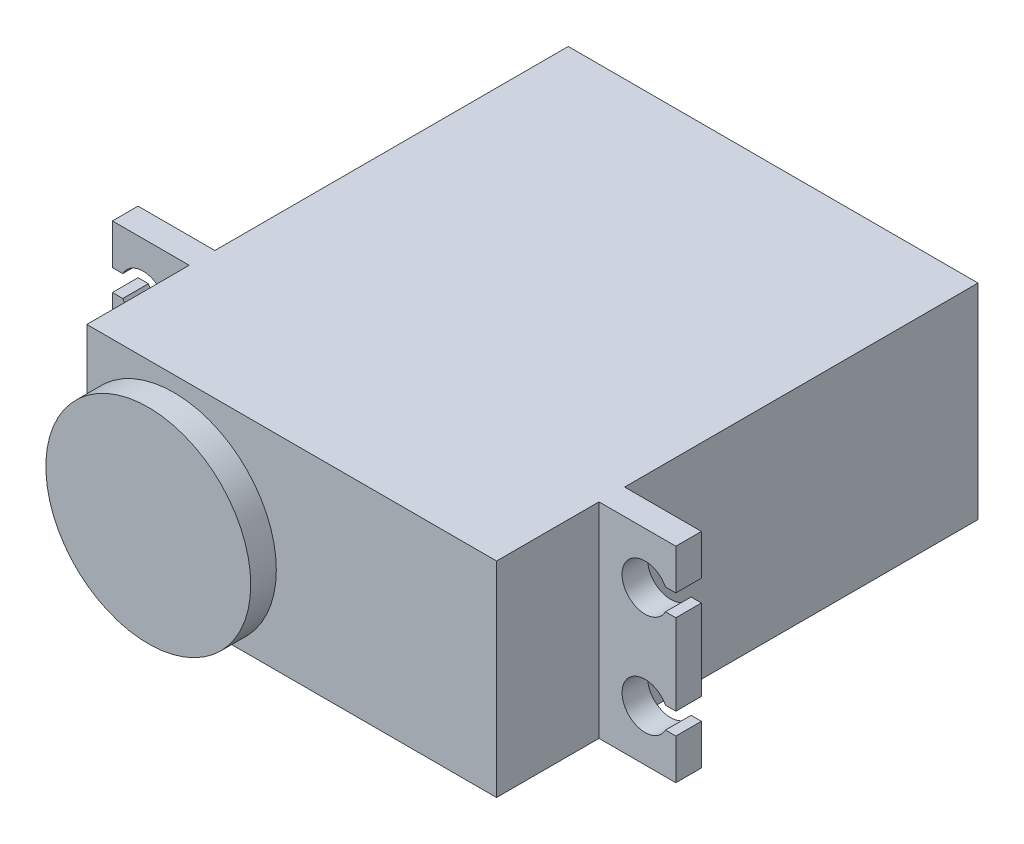
ISO-10303-21;
HEADER;
FILE_DESCRIPTION(('STEP AP214'),'2;1');
FILE_NAME('part.step','',(''),(''),'','','');
FILE_SCHEMA(('AUTOMOTIVE_DESIGN { 1 0 10303 214 1 1 1 1 }'));
ENDSEC;
DATA;
#1=APPLICATION_CONTEXT('core data for automotive mechanical design processes');
#2=APPLICATION_PROTOCOL_DEFINITION('international standard','automotive_design',2000,#1);
#3=PRODUCT_CONTEXT('',#1,'mechanical');
#4=PRODUCT('Part','Part','',(#3));
#5=PRODUCT_RELATED_PRODUCT_CATEGORY('part','',(#4));
#6=PRODUCT_DEFINITION_FORMATION('','',#4);
#7=PRODUCT_DEFINITION_CONTEXT('part definition',#1,'design');
#8=PRODUCT_DEFINITION('design','',#6,#7);
#9=PRODUCT_DEFINITION_SHAPE('','',#8);
#10=(LENGTH_UNIT() NAMED_UNIT(*) SI_UNIT(.MILLI.,.METRE.));
#11=(NAMED_UNIT(*) PLANE_ANGLE_UNIT() SI_UNIT($,.RADIAN.));
#12=(NAMED_UNIT(*) SI_UNIT($,.STERADIAN.) SOLID_ANGLE_UNIT());
#13=UNCERTAINTY_MEASURE_WITH_UNIT(LENGTH_MEASURE(1.E-05),#10,'distance_accuracy_value','');
#14=(GEOMETRIC_REPRESENTATION_CONTEXT(3) GLOBAL_UNCERTAINTY_ASSIGNED_CONTEXT((#13)) GLOBAL_UNIT_ASSIGNED_CONTEXT((#10,
#11,#12)) REPRESENTATION_CONTEXT('',''));
#15=CARTESIAN_POINT('',(0.,0.,0.));
#16=DIRECTION('',(0.,0.,1.));
#17=DIRECTION('',(1.,0.,0.));
#18=AXIS2_PLACEMENT_3D('',#15,#16,#17);
#19=CARTESIAN_POINT('',(47.5,0.,-12.5));
#20=DIRECTION('',(0.,0.,1.));
#21=DIRECTION('',(1.,0.,0.));
#22=AXIS2_PLACEMENT_3D('',#19,#20,#21);
#23=PLANE('',#22);
#24=DIRECTION('',(-1.,0.,0.));
#25=VECTOR('',#24,1.);
#26=CARTESIAN_POINT('',(40.,16.05,-12.5));
#27=LINE('',#26,#25);
#28=CARTESIAN_POINT('',(47.5,16.05,-12.5));
#29=VERTEX_POINT('',#28);
#30=CARTESIAN_POINT('',(46.4899748742132,16.05,-12.5));
#31=VERTEX_POINT('',#30);
#32=EDGE_CURVE('E221',#29,#31,#27,.T.);
#33=ORIENTED_EDGE('',*,*,#32,.T.);
#34=CARTESIAN_POINT('',(44.5,15.,-12.5));
#35=DIRECTION('',(0.,0.,1.));
#36=DIRECTION('',(1.,0.,0.));
#37=AXIS2_PLACEMENT_3D('',#34,#35,#36);
#38=CIRCLE('',#37,2.25);
#39=CARTESIAN_POINT('',(46.4899748742132,13.95,-12.5));
#40=VERTEX_POINT('',#39);
#41=EDGE_CURVE('E232',#31,#40,#38,.T.);
#42=ORIENTED_EDGE('',*,*,#41,.T.);
#43=DIRECTION('',(1.,0.,0.));
#44=VECTOR('',#43,1.);
#45=CARTESIAN_POINT('',(40.,13.95,-12.5));
#46=LINE('',#45,#44);
#47=CARTESIAN_POINT('',(47.5,13.95,-12.5));
#48=VERTEX_POINT('',#47);
#49=EDGE_CURVE('E271',#40,#48,#46,.T.);
#50=ORIENTED_EDGE('',*,*,#49,.T.);
#51=DIRECTION('',(0.,1.,0.));
#52=VECTOR('',#51,1.);
#53=CARTESIAN_POINT('',(47.5,0.,-12.5));
#54=LINE('',#53,#52);
#55=CARTESIAN_POINT('',(47.5,6.05,-12.5));
#56=VERTEX_POINT('',#55);
#57=EDGE_CURVE('E247',#56,#48,#54,.T.);
#58=ORIENTED_EDGE('',*,*,#57,.F.);
#59=DIRECTION('',(1.,0.,0.));
#60=VECTOR('',#59,1.);
#61=CARTESIAN_POINT('',(40.,6.05,-12.5));
#62=LINE('',#61,#60);
#63=CARTESIAN_POINT('',(46.4899748742132,6.05,-12.5));
#64=VERTEX_POINT('',#63);
#65=EDGE_CURVE('E484',#64,#56,#62,.T.);
#66=ORIENTED_EDGE('',*,*,#65,.F.);
#67=CARTESIAN_POINT('',(44.5,5.,-12.5));
#68=DIRECTION('',(0.,0.,1.));
#69=DIRECTION('',(1.,0.,0.));
#70=AXIS2_PLACEMENT_3D('',#67,#68,#69);
#71=CIRCLE('',#70,2.25);
#72=CARTESIAN_POINT('',(46.4899748742132,3.95,-12.5));
#73=VERTEX_POINT('',#72);
#74=EDGE_CURVE('E482',#64,#73,#71,.T.);
#75=ORIENTED_EDGE('',*,*,#74,.T.);
#76=DIRECTION('',(1.,0.,0.));
#77=VECTOR('',#76,1.);
#78=CARTESIAN_POINT('',(40.,3.95,-12.5));
#79=LINE('',#78,#77);
#80=CARTESIAN_POINT('',(47.5,3.95,-12.5));
#81=VERTEX_POINT('',#80);
#82=EDGE_CURVE('E462',#73,#81,#79,.T.);
#83=ORIENTED_EDGE('',*,*,#82,.T.);
#84=CARTESIAN_POINT('',(47.5,0.,-12.5));
#85=VERTEX_POINT('',#84);
#86=EDGE_CURVE('E250',#85,#81,#54,.T.);
#87=ORIENTED_EDGE('',*,*,#86,.F.);
#88=DIRECTION('',(-1.,0.,0.));
#89=VECTOR('',#88,1.);
#90=CARTESIAN_POINT('',(47.5,0.,-12.5));
#91=LINE('',#90,#89);
#92=CARTESIAN_POINT('',(40.,0.,-12.5));
#93=VERTEX_POINT('',#92);
#94=EDGE_CURVE('E279',#85,#93,#91,.T.);
#95=ORIENTED_EDGE('',*,*,#94,.T.);
#96=DIRECTION('',(0.,1.,0.));
#97=VECTOR('',#96,1.);
#98=CARTESIAN_POINT('',(40.,0.,-12.5));
#99=LINE('',#98,#97);
#100=CARTESIAN_POINT('',(40.,20.,-12.5));
#101=VERTEX_POINT('',#100);
#102=EDGE_CURVE('E269',#93,#101,#99,.T.);
#103=ORIENTED_EDGE('',*,*,#102,.T.);
#104=DIRECTION('',(-1.,0.,0.));
#105=VECTOR('',#104,1.);
#106=CARTESIAN_POINT('',(47.5,20.,-12.5));
#107=LINE('',#106,#105);
#108=CARTESIAN_POINT('',(47.5,20.,-12.5));
#109=VERTEX_POINT('',#108);
#110=EDGE_CURVE('E245',#109,#101,#107,.T.);
#111=ORIENTED_EDGE('',*,*,#110,.F.);
#112=EDGE_CURVE('E238',#29,#109,#54,.T.);
#113=ORIENTED_EDGE('',*,*,#112,.F.);
#114=EDGE_LOOP('',(#33,#42,#50,#58,#66,#75,#83,#87,#95,#103,#111,#113));
#115=FACE_BOUND('',#114,.T.);
#116=ADVANCED_FACE('F36',(#115),#23,.F.);
#117=CARTESIAN_POINT('',(47.5,0.,-10.));
#118=DIRECTION('',(0.,0.,1.));
#119=DIRECTION('',(1.,0.,0.));
#120=AXIS2_PLACEMENT_3D('',#117,#118,#119);
#121=PLANE('',#120);
#122=CARTESIAN_POINT('',(44.5,15.,-10.));
#123=DIRECTION('',(0.,0.,-1.));
#124=DIRECTION('',(-1.,0.,0.));
#125=AXIS2_PLACEMENT_3D('',#122,#123,#124);
#126=CIRCLE('',#125,2.25);
#127=CARTESIAN_POINT('',(46.4899748742132,13.95,-10.));
#128=VERTEX_POINT('',#127);
#129=CARTESIAN_POINT('',(46.4899748742132,16.05,-10.));
#130=VERTEX_POINT('',#129);
#131=EDGE_CURVE('E231',#128,#130,#126,.T.);
#132=ORIENTED_EDGE('',*,*,#131,.T.);
#133=DIRECTION('',(1.,0.,0.));
#134=VECTOR('',#133,1.);
#135=CARTESIAN_POINT('',(40.,16.05,-10.));
#136=LINE('',#135,#134);
#137=CARTESIAN_POINT('',(47.5,16.05,-10.));
#138=VERTEX_POINT('',#137);
#139=EDGE_CURVE('E470',#130,#138,#136,.T.);
#140=ORIENTED_EDGE('',*,*,#139,.T.);
#141=DIRECTION('',(0.,1.,0.));
#142=VECTOR('',#141,1.);
#143=CARTESIAN_POINT('',(47.5,0.,-10.));
#144=LINE('',#143,#142);
#145=CARTESIAN_POINT('',(47.5,20.,-10.));
#146=VERTEX_POINT('',#145);
#147=EDGE_CURVE('E240',#138,#146,#144,.T.);
#148=ORIENTED_EDGE('',*,*,#147,.T.);
#149=DIRECTION('',(-1.,0.,0.));
#150=VECTOR('',#149,1.);
#151=CARTESIAN_POINT('',(47.5,20.,-10.));
#152=LINE('',#151,#150);
#153=CARTESIAN_POINT('',(40.,20.,-10.));
#154=VERTEX_POINT('',#153);
#155=EDGE_CURVE('E275',#146,#154,#152,.T.);
#156=ORIENTED_EDGE('',*,*,#155,.T.);
#157=DIRECTION('',(0.,1.,0.));
#158=VECTOR('',#157,1.);
#159=CARTESIAN_POINT('',(40.,0.,-10.));
#160=LINE('',#159,#158);
#161=CARTESIAN_POINT('',(40.,0.,-10.));
#162=VERTEX_POINT('',#161);
#163=EDGE_CURVE('E253',#162,#154,#160,.T.);
#164=ORIENTED_EDGE('',*,*,#163,.F.);
#165=DIRECTION('',(-1.,0.,0.));
#166=VECTOR('',#165,1.);
#167=CARTESIAN_POINT('',(47.5,0.,-10.));
#168=LINE('',#167,#166);
#169=CARTESIAN_POINT('',(47.5,0.,-10.));
#170=VERTEX_POINT('',#169);
#171=EDGE_CURVE('E268',#170,#162,#168,.T.);
#172=ORIENTED_EDGE('',*,*,#171,.F.);
#173=CARTESIAN_POINT('',(47.5,3.95,-10.));
#174=VERTEX_POINT('',#173);
#175=EDGE_CURVE('E265',#170,#174,#144,.T.);
#176=ORIENTED_EDGE('',*,*,#175,.T.);
#177=DIRECTION('',(-1.,0.,0.));
#178=VECTOR('',#177,1.);
#179=CARTESIAN_POINT('',(40.,3.95,-10.));
#180=LINE('',#179,#178);
#181=CARTESIAN_POINT('',(46.4899748742132,3.95,-10.));
#182=VERTEX_POINT('',#181);
#183=EDGE_CURVE('E59',#174,#182,#180,.T.);
#184=ORIENTED_EDGE('',*,*,#183,.T.);
#185=CARTESIAN_POINT('',(44.5,5.,-10.));
#186=DIRECTION('',(0.,0.,-1.));
#187=DIRECTION('',(-1.,0.,0.));
#188=AXIS2_PLACEMENT_3D('',#185,#186,#187);
#189=CIRCLE('',#188,2.25);
#190=CARTESIAN_POINT('',(46.4899748742132,6.05,-10.));
#191=VERTEX_POINT('',#190);
#192=EDGE_CURVE('E486',#182,#191,#189,.T.);
#193=ORIENTED_EDGE('',*,*,#192,.T.);
#194=DIRECTION('',(-1.,0.,0.));
#195=VECTOR('',#194,1.);
#196=CARTESIAN_POINT('',(40.,6.05,-10.));
#197=LINE('',#196,#195);
#198=CARTESIAN_POINT('',(47.5,6.05,-10.));
#199=VERTEX_POINT('',#198);
#200=EDGE_CURVE('E489',#199,#191,#197,.T.);
#201=ORIENTED_EDGE('',*,*,#200,.F.);
#202=CARTESIAN_POINT('',(47.5,13.95,-10.));
#203=VERTEX_POINT('',#202);
#204=EDGE_CURVE('E263',#199,#203,#144,.T.);
#205=ORIENTED_EDGE('',*,*,#204,.T.);
#206=DIRECTION('',(-1.,0.,0.));
#207=VECTOR('',#206,1.);
#208=CARTESIAN_POINT('',(40.,13.95,-10.));
#209=LINE('',#208,#207);
#210=EDGE_CURVE('E51',#203,#128,#209,.T.);
#211=ORIENTED_EDGE('',*,*,#210,.T.);
#212=EDGE_LOOP('',(#132,#140,#148,#156,#164,#172,#176,#184,#193,#201,#205,#211));
#213=FACE_BOUND('',#212,.T.);
#214=ADVANCED_FACE('F468',(#213),#121,.T.);
#215=CARTESIAN_POINT('',(47.5,0.,0.));
#216=DIRECTION('',(1.,0.,0.));
#217=DIRECTION('',(0.,0.,1.));
#218=AXIS2_PLACEMENT_3D('',#215,#216,#217);
#219=PLANE('',#218);
#220=ORIENTED_EDGE('',*,*,#147,.F.);
#221=DIRECTION('',(0.,0.,1.));
#222=VECTOR('',#221,1.);
#223=CARTESIAN_POINT('',(47.5,16.05,-47.001));
#224=LINE('',#223,#222);
#225=EDGE_CURVE('E225',#29,#138,#224,.T.);
#226=ORIENTED_EDGE('',*,*,#225,.F.);
#227=ORIENTED_EDGE('',*,*,#112,.T.);
#228=DIRECTION('',(0.,0.,-1.));
#229=VECTOR('',#228,1.);
#230=CARTESIAN_POINT('',(47.5,20.,0.));
#231=LINE('',#230,#229);
#232=EDGE_CURVE('E257',#146,#109,#231,.T.);
#233=ORIENTED_EDGE('',*,*,#232,.F.);
#234=EDGE_LOOP('',(#220,#226,#227,#233));
#235=FACE_BOUND('',#234,.T.);
#236=ADVANCED_FACE('F236',(#235),#219,.T.);
#237=ORIENTED_EDGE('',*,*,#57,.T.);
#238=DIRECTION('',(0.,0.,1.));
#239=VECTOR('',#238,1.);
#240=CARTESIAN_POINT('',(47.5,13.95,-47.001));
#241=LINE('',#240,#239);
#242=EDGE_CURVE('E241',#48,#203,#241,.T.);
#243=ORIENTED_EDGE('',*,*,#242,.T.);
#244=ORIENTED_EDGE('',*,*,#204,.F.);
#245=DIRECTION('',(0.,0.,1.));
#246=VECTOR('',#245,1.);
#247=CARTESIAN_POINT('',(47.5,6.05,-47.001));
#248=LINE('',#247,#246);
#249=EDGE_CURVE('E495',#56,#199,#248,.T.);
#250=ORIENTED_EDGE('',*,*,#249,.F.);
#251=EDGE_LOOP('',(#237,#243,#244,#250));
#252=FACE_BOUND('',#251,.T.);
#253=ADVANCED_FACE('F508',(#252),#219,.T.);
#254=ORIENTED_EDGE('',*,*,#86,.T.);
#255=DIRECTION('',(0.,0.,1.));
#256=VECTOR('',#255,1.);
#257=CARTESIAN_POINT('',(47.5,3.95,-47.001));
#258=LINE('',#257,#256);
#259=EDGE_CURVE('E465',#81,#174,#258,.T.);
#260=ORIENTED_EDGE('',*,*,#259,.T.);
#261=ORIENTED_EDGE('',*,*,#175,.F.);
#262=DIRECTION('',(0.,0.,1.));
#263=VECTOR('',#262,1.);
#264=CARTESIAN_POINT('',(47.5,0.,0.));
#265=LINE('',#264,#263);
#266=EDGE_CURVE('E248',#85,#170,#265,.T.);
#267=ORIENTED_EDGE('',*,*,#266,.F.);
#268=EDGE_LOOP('',(#254,#260,#261,#267));
#269=FACE_BOUND('',#268,.T.);
#270=ADVANCED_FACE('F464',(#269),#219,.T.);
#271=CARTESIAN_POINT('',(40.,0.,0.));
#272=DIRECTION('',(-1.,0.,0.));
#273=DIRECTION('',(0.,0.,1.));
#274=AXIS2_PLACEMENT_3D('',#271,#272,#273);
#275=PLANE('',#274);
#276=ORIENTED_EDGE('',*,*,#102,.F.);
#277=DIRECTION('',(0.,0.,-1.));
#278=VECTOR('',#277,1.);
#279=CARTESIAN_POINT('',(40.,0.,0.));
#280=LINE('',#279,#278);
#281=CARTESIAN_POINT('',(40.,0.,-47.));
#282=VERTEX_POINT('',#281);
#283=EDGE_CURVE('E378',#93,#282,#280,.T.);
#284=ORIENTED_EDGE('',*,*,#283,.T.);
#285=DIRECTION('',(0.,1.,0.));
#286=VECTOR('',#285,1.);
#287=CARTESIAN_POINT('',(40.,0.,-47.));
#288=LINE('',#287,#286);
#289=CARTESIAN_POINT('',(40.,20.,-47.));
#290=VERTEX_POINT('',#289);
#291=EDGE_CURVE('E382',#282,#290,#288,.T.);
#292=ORIENTED_EDGE('',*,*,#291,.T.);
#293=DIRECTION('',(0.,0.,1.));
#294=VECTOR('',#293,1.);
#295=CARTESIAN_POINT('',(40.,20.,0.));
#296=LINE('',#295,#294);
#297=EDGE_CURVE('E385',#290,#101,#296,.T.);
#298=ORIENTED_EDGE('',*,*,#297,.T.);
#299=EDGE_LOOP('',(#276,#284,#292,#298));
#300=FACE_BOUND('',#299,.T.);
#301=ADVANCED_FACE('F585',(#300),#275,.F.);
#302=CARTESIAN_POINT('',(-7.5,0.,0.));
#303=DIRECTION('',(-1.,0.,0.));
#304=DIRECTION('',(0.,0.,1.));
#305=AXIS2_PLACEMENT_3D('',#302,#303,#304);
#306=PLANE('',#305);
#307=DIRECTION('',(0.,0.,1.));
#308=VECTOR('',#307,1.);
#309=CARTESIAN_POINT('',(-7.5,13.95,-47.001));
#310=LINE('',#309,#308);
#311=CARTESIAN_POINT('',(-7.5,13.95,-12.5));
#312=VERTEX_POINT('',#311);
#313=CARTESIAN_POINT('',(-7.5,13.95,-10.));
#314=VERTEX_POINT('',#313);
#315=EDGE_CURVE('E302',#312,#314,#310,.T.);
#316=ORIENTED_EDGE('',*,*,#315,.F.);
#317=DIRECTION('',(0.,1.,0.));
#318=VECTOR('',#317,1.);
#319=CARTESIAN_POINT('',(-7.5,0.,-12.5));
#320=LINE('',#319,#318);
#321=CARTESIAN_POINT('',(-7.5,6.05,-12.5));
#322=VERTEX_POINT('',#321);
#323=EDGE_CURVE('E353',#322,#312,#320,.T.);
#324=ORIENTED_EDGE('',*,*,#323,.F.);
#325=DIRECTION('',(0.,0.,1.));
#326=VECTOR('',#325,1.);
#327=CARTESIAN_POINT('',(-7.5,6.05,-47.001));
#328=LINE('',#327,#326);
#329=CARTESIAN_POINT('',(-7.5,6.05,-10.));
#330=VERTEX_POINT('',#329);
#331=EDGE_CURVE('E330',#322,#330,#328,.T.);
#332=ORIENTED_EDGE('',*,*,#331,.T.);
#333=DIRECTION('',(0.,1.,0.));
#334=VECTOR('',#333,1.);
#335=CARTESIAN_POINT('',(-7.5,0.,-10.));
#336=LINE('',#335,#334);
#337=EDGE_CURVE('E345',#330,#314,#336,.T.);
#338=ORIENTED_EDGE('',*,*,#337,.T.);
#339=EDGE_LOOP('',(#316,#324,#332,#338));
#340=FACE_BOUND('',#339,.T.);
#341=ADVANCED_FACE('F563',(#340),#306,.T.);
#342=DIRECTION('',(0.,0.,1.));
#343=VECTOR('',#342,1.);
#344=CARTESIAN_POINT('',(-7.5,16.05,-47.001));
#345=LINE('',#344,#343);
#346=CARTESIAN_POINT('',(-7.5,16.05,-12.5));
#347=VERTEX_POINT('',#346);
#348=CARTESIAN_POINT('',(-7.5,16.05,-10.));
#349=VERTEX_POINT('',#348);
#350=EDGE_CURVE('E304',#347,#349,#345,.T.);
#351=ORIENTED_EDGE('',*,*,#350,.T.);
#352=CARTESIAN_POINT('',(-7.5,20.,-10.));
#353=VERTEX_POINT('',#352);
#354=EDGE_CURVE('E339',#349,#353,#336,.T.);
#355=ORIENTED_EDGE('',*,*,#354,.T.);
#356=DIRECTION('',(0.,0.,-1.));
#357=VECTOR('',#356,1.);
#358=CARTESIAN_POINT('',(-7.5,20.,0.));
#359=LINE('',#358,#357);
#360=CARTESIAN_POINT('',(-7.5,20.,-12.5));
#361=VERTEX_POINT('',#360);
#362=EDGE_CURVE('E344',#353,#361,#359,.T.);
#363=ORIENTED_EDGE('',*,*,#362,.T.);
#364=EDGE_CURVE('E348',#347,#361,#320,.T.);
#365=ORIENTED_EDGE('',*,*,#364,.F.);
#366=EDGE_LOOP('',(#351,#355,#363,#365));
#367=FACE_BOUND('',#366,.T.);
#368=ADVANCED_FACE('F564',(#367),#306,.T.);
#369=CARTESIAN_POINT('',(0.,0.,0.));
#370=DIRECTION('',(-1.,0.,0.));
#371=DIRECTION('',(0.,0.,1.));
#372=AXIS2_PLACEMENT_3D('',#369,#370,#371);
#373=PLANE('',#372);
#374=DIRECTION('',(0.,0.,-1.));
#375=VECTOR('',#374,1.);
#376=CARTESIAN_POINT('',(0.,0.,0.));
#377=LINE('',#376,#375);
#378=CARTESIAN_POINT('',(0.,0.,-12.5));
#379=VERTEX_POINT('',#378);
#380=CARTESIAN_POINT('',(0.,0.,-47.));
#381=VERTEX_POINT('',#380);
#382=EDGE_CURVE('E390',#379,#381,#377,.T.);
#383=ORIENTED_EDGE('',*,*,#382,.F.);
#384=DIRECTION('',(0.,1.,0.));
#385=VECTOR('',#384,1.);
#386=CARTESIAN_POINT('',(0.,0.,-12.5));
#387=LINE('',#386,#385);
#388=CARTESIAN_POINT('',(0.,20.,-12.5));
#389=VERTEX_POINT('',#388);
#390=EDGE_CURVE('E340',#379,#389,#387,.T.);
#391=ORIENTED_EDGE('',*,*,#390,.T.);
#392=DIRECTION('',(0.,0.,1.));
#393=VECTOR('',#392,1.);
#394=CARTESIAN_POINT('',(0.,20.,0.));
#395=LINE('',#394,#393);
#396=CARTESIAN_POINT('',(0.,20.,-47.));
#397=VERTEX_POINT('',#396);
#398=EDGE_CURVE('E379',#397,#389,#395,.T.);
#399=ORIENTED_EDGE('',*,*,#398,.F.);
#400=DIRECTION('',(0.,1.,0.));
#401=VECTOR('',#400,1.);
#402=CARTESIAN_POINT('',(0.,0.,-47.));
#403=LINE('',#402,#401);
#404=EDGE_CURVE('E394',#381,#397,#403,.T.);
#405=ORIENTED_EDGE('',*,*,#404,.F.);
#406=EDGE_LOOP('',(#383,#391,#399,#405));
#407=FACE_BOUND('',#406,.T.);
#408=ADVANCED_FACE('F450',(#407),#373,.T.);
#409=CARTESIAN_POINT('',(10.,10.,4.));
#410=DIRECTION('',(0.,0.,-1.));
#411=DIRECTION('',(-1.,0.,0.));
#412=AXIS2_PLACEMENT_3D('',#409,#410,#411);
#413=CYLINDRICAL_SURFACE('',#412,2.95);
#414=CARTESIAN_POINT('',(10.,10.,0.));
#415=DIRECTION('',(0.,0.,-1.));
#416=DIRECTION('',(-1.,0.,0.));
#417=AXIS2_PLACEMENT_3D('',#414,#415,#416);
#418=CIRCLE('',#417,2.95);
#419=CARTESIAN_POINT('',(7.05,10.,0.));
#420=VERTEX_POINT('',#419);
#421=EDGE_CURVE('E44',#420,#420,#418,.F.);
#422=ORIENTED_EDGE('',*,*,#421,.T.);
#423=EDGE_LOOP('',(#422));
#424=FACE_BOUND('',#423,.T.);
#425=CARTESIAN_POINT('',(10.,10.,1.5));
#426=DIRECTION('',(0.,0.,1.));
#427=DIRECTION('',(1.,0.,0.));
#428=AXIS2_PLACEMENT_3D('',#425,#426,#427);
#429=CIRCLE('',#428,2.95);
#430=CARTESIAN_POINT('',(12.95,10.,1.5));
#431=VERTEX_POINT('',#430);
#432=EDGE_CURVE('E11',#431,#431,#429,.T.);
#433=ORIENTED_EDGE('',*,*,#432,.F.);
#434=EDGE_LOOP('',(#433));
#435=FACE_BOUND('',#434,.T.);
#436=ADVANCED_FACE('F412',(#424,#435),#413,.T.);
#437=CARTESIAN_POINT('',(40.,0.,0.));
#438=DIRECTION('',(0.,0.,-1.));
#439=DIRECTION('',(-1.,0.,0.));
#440=AXIS2_PLACEMENT_3D('',#437,#438,#439);
#441=PLANE('',#440);
#442=ORIENTED_EDGE('',*,*,#421,.F.);
#443=EDGE_LOOP('',(#442));
#444=FACE_BOUND('',#443,.T.);
#445=DIRECTION('',(0.,-1.,0.));
#446=VECTOR('',#445,1.);
#447=CARTESIAN_POINT('',(0.,0.,0.));
#448=LINE('',#447,#446);
#449=CARTESIAN_POINT('',(0.,20.,0.));
#450=VERTEX_POINT('',#449);
#451=CARTESIAN_POINT('',(0.,0.,0.));
#452=VERTEX_POINT('',#451);
#453=EDGE_CURVE('E372',#450,#452,#448,.T.);
#454=ORIENTED_EDGE('',*,*,#453,.T.);
#455=DIRECTION('',(-1.,0.,0.));
#456=VECTOR('',#455,1.);
#457=CARTESIAN_POINT('',(40.,0.,0.));
#458=LINE('',#457,#456);
#459=CARTESIAN_POINT('',(40.,0.,0.));
#460=VERTEX_POINT('',#459);
#461=EDGE_CURVE('E407',#460,#452,#458,.T.);
#462=ORIENTED_EDGE('',*,*,#461,.F.);
#463=DIRECTION('',(0.,-1.,0.));
#464=VECTOR('',#463,1.);
#465=CARTESIAN_POINT('',(40.,0.,0.));
#466=LINE('',#465,#464);
#467=CARTESIAN_POINT('',(40.,20.,0.));
#468=VERTEX_POINT('',#467);
#469=EDGE_CURVE('E375',#468,#460,#466,.T.);
#470=ORIENTED_EDGE('',*,*,#469,.F.);
#471=DIRECTION('',(-1.,0.,0.));
#472=VECTOR('',#471,1.);
#473=CARTESIAN_POINT('',(40.,20.,0.));
#474=LINE('',#473,#472);
#475=EDGE_CURVE('E387',#468,#450,#474,.T.);
#476=ORIENTED_EDGE('',*,*,#475,.T.);
#477=EDGE_LOOP('',(#454,#462,#470,#476));
#478=FACE_BOUND('',#477,.T.);
#479=ADVANCED_FACE('F38',(#444,#478),#441,.F.);
#480=CARTESIAN_POINT('',(40.,0.,0.));
#481=DIRECTION('',(0.,1.,0.));
#482=DIRECTION('',(0.,0.,1.));
#483=AXIS2_PLACEMENT_3D('',#480,#481,#482);
#484=PLANE('',#483);
#485=CARTESIAN_POINT('',(0.,0.,-10.));
#486=VERTEX_POINT('',#485);
#487=EDGE_CURVE('E391',#452,#486,#377,.T.);
#488=ORIENTED_EDGE('',*,*,#487,.T.);
#489=DIRECTION('',(1.,0.,0.));
#490=VECTOR('',#489,1.);
#491=CARTESIAN_POINT('',(-7.5,0.,-10.));
#492=LINE('',#491,#490);
#493=CARTESIAN_POINT('',(-7.5,0.,-10.));
#494=VERTEX_POINT('',#493);
#495=EDGE_CURVE('E365',#494,#486,#492,.T.);
#496=ORIENTED_EDGE('',*,*,#495,.F.);
#497=DIRECTION('',(0.,0.,1.));
#498=VECTOR('',#497,1.);
#499=CARTESIAN_POINT('',(-7.5,0.,0.));
#500=LINE('',#499,#498);
#501=CARTESIAN_POINT('',(-7.5,0.,-12.5));
#502=VERTEX_POINT('',#501);
#503=EDGE_CURVE('E336',#502,#494,#500,.T.);
#504=ORIENTED_EDGE('',*,*,#503,.F.);
#505=DIRECTION('',(1.,0.,0.));
#506=VECTOR('',#505,1.);
#507=CARTESIAN_POINT('',(-7.5,0.,-12.5));
#508=LINE('',#507,#506);
#509=EDGE_CURVE('E352',#502,#379,#508,.T.);
#510=ORIENTED_EDGE('',*,*,#509,.T.);
#511=ORIENTED_EDGE('',*,*,#382,.T.);
#512=DIRECTION('',(-1.,0.,0.));
#513=VECTOR('',#512,1.);
#514=CARTESIAN_POINT('',(40.,0.,-47.));
#515=LINE('',#514,#513);
#516=EDGE_CURVE('E404',#282,#381,#515,.T.);
#517=ORIENTED_EDGE('',*,*,#516,.F.);
#518=ORIENTED_EDGE('',*,*,#283,.F.);
#519=ORIENTED_EDGE('',*,*,#94,.F.);
#520=ORIENTED_EDGE('',*,*,#266,.T.);
#521=ORIENTED_EDGE('',*,*,#171,.T.);
#522=EDGE_CURVE('E380',#460,#162,#280,.T.);
#523=ORIENTED_EDGE('',*,*,#522,.F.);
#524=ORIENTED_EDGE('',*,*,#461,.T.);
#525=EDGE_LOOP('',(#488,#496,#504,#510,#511,#517,#518,#519,#520,#521,#523,#524));
#526=FACE_BOUND('',#525,.T.);
#527=ADVANCED_FACE('F417',(#526),#484,.F.);
#528=CARTESIAN_POINT('',(40.,0.,-47.));
#529=DIRECTION('',(0.,0.,1.));
#530=DIRECTION('',(1.,0.,0.));
#531=AXIS2_PLACEMENT_3D('',#528,#529,#530);
#532=PLANE('',#531);
#533=ORIENTED_EDGE('',*,*,#404,.T.);
#534=DIRECTION('',(-1.,0.,0.));
#535=VECTOR('',#534,1.);
#536=CARTESIAN_POINT('',(40.,20.,-47.));
#537=LINE('',#536,#535);
#538=EDGE_CURVE('E401',#290,#397,#537,.T.);
#539=ORIENTED_EDGE('',*,*,#538,.F.);
#540=ORIENTED_EDGE('',*,*,#291,.F.);
#541=ORIENTED_EDGE('',*,*,#516,.T.);
#542=EDGE_LOOP('',(#533,#539,#540,#541));
#543=FACE_BOUND('',#542,.T.);
#544=ADVANCED_FACE('F456',(#543),#532,.F.);
#545=CARTESIAN_POINT('',(40.,20.,0.));
#546=DIRECTION('',(0.,-1.,0.));
#547=DIRECTION('',(0.,0.,-1.));
#548=AXIS2_PLACEMENT_3D('',#545,#546,#547);
#549=PLANE('',#548);
#550=ORIENTED_EDGE('',*,*,#398,.T.);
#551=DIRECTION('',(1.,0.,0.));
#552=VECTOR('',#551,1.);
#553=CARTESIAN_POINT('',(-7.5,20.,-12.5));
#554=LINE('',#553,#552);
#555=EDGE_CURVE('E359',#361,#389,#554,.T.);
#556=ORIENTED_EDGE('',*,*,#555,.F.);
#557=ORIENTED_EDGE('',*,*,#362,.F.);
#558=DIRECTION('',(1.,0.,0.));
#559=VECTOR('',#558,1.);
#560=CARTESIAN_POINT('',(-7.5,20.,-10.));
#561=LINE('',#560,#559);
#562=CARTESIAN_POINT('',(0.,20.,-10.));
#563=VERTEX_POINT('',#562);
#564=EDGE_CURVE('E362',#353,#563,#561,.T.);
#565=ORIENTED_EDGE('',*,*,#564,.T.);
#566=EDGE_CURVE('E396',#563,#450,#395,.T.);
#567=ORIENTED_EDGE('',*,*,#566,.T.);
#568=ORIENTED_EDGE('',*,*,#475,.F.);
#569=EDGE_CURVE('E384',#154,#468,#296,.T.);
#570=ORIENTED_EDGE('',*,*,#569,.F.);
#571=ORIENTED_EDGE('',*,*,#155,.F.);
#572=ORIENTED_EDGE('',*,*,#232,.T.);
#573=ORIENTED_EDGE('',*,*,#110,.T.);
#574=ORIENTED_EDGE('',*,*,#297,.F.);
#575=ORIENTED_EDGE('',*,*,#538,.T.);
#576=EDGE_LOOP('',(#550,#556,#557,#565,#567,#568,#570,#571,#572,#573,#574,#575));
#577=FACE_BOUND('',#576,.T.);
#578=ADVANCED_FACE('F430',(#577),#549,.F.);
#579=ORIENTED_EDGE('',*,*,#522,.T.);
#580=ORIENTED_EDGE('',*,*,#163,.T.);
#581=ORIENTED_EDGE('',*,*,#569,.T.);
#582=ORIENTED_EDGE('',*,*,#469,.T.);
#583=EDGE_LOOP('',(#579,#580,#581,#582));
#584=FACE_BOUND('',#583,.T.);
#585=ADVANCED_FACE('F428',(#584),#275,.F.);
#586=DIRECTION('',(0.,1.,0.));
#587=VECTOR('',#586,1.);
#588=CARTESIAN_POINT('',(0.,0.,-10.));
#589=LINE('',#588,#587);
#590=EDGE_CURVE('E310',#486,#563,#589,.T.);
#591=ORIENTED_EDGE('',*,*,#590,.F.);
#592=ORIENTED_EDGE('',*,*,#487,.F.);
#593=ORIENTED_EDGE('',*,*,#453,.F.);
#594=ORIENTED_EDGE('',*,*,#566,.F.);
#595=EDGE_LOOP('',(#591,#592,#593,#594));
#596=FACE_BOUND('',#595,.T.);
#597=ADVANCED_FACE('F423',(#596),#373,.T.);
#598=CARTESIAN_POINT('',(10.,10.,1.5));
#599=DIRECTION('',(0.,0.,1.));
#600=DIRECTION('',(1.,0.,0.));
#601=AXIS2_PLACEMENT_3D('',#598,#599,#600);
#602=CYLINDRICAL_SURFACE('',#601,10.);
#603=CARTESIAN_POINT('',(10.,10.,1.5));
#604=DIRECTION('',(0.,0.,1.));
#605=DIRECTION('',(1.,0.,0.));
#606=AXIS2_PLACEMENT_3D('',#603,#604,#605);
#607=CIRCLE('',#606,10.);
#608=CARTESIAN_POINT('',(20.,10.,1.5));
#609=VERTEX_POINT('',#608);
#610=EDGE_CURVE('E369',#609,#609,#607,.T.);
#611=ORIENTED_EDGE('',*,*,#610,.T.);
#612=EDGE_LOOP('',(#611));
#613=FACE_BOUND('',#612,.T.);
#614=CARTESIAN_POINT('',(10.,10.,4.));
#615=DIRECTION('',(0.,0.,1.));
#616=DIRECTION('',(1.,0.,0.));
#617=AXIS2_PLACEMENT_3D('',#614,#615,#616);
#618=CIRCLE('',#617,10.);
#619=CARTESIAN_POINT('',(20.,10.,4.));
#620=VERTEX_POINT('',#619);
#621=EDGE_CURVE('E368',#620,#620,#618,.T.);
#622=ORIENTED_EDGE('',*,*,#621,.F.);
#623=EDGE_LOOP('',(#622));
#624=FACE_BOUND('',#623,.T.);
#625=ADVANCED_FACE('F573',(#613,#624),#602,.T.);
#626=CARTESIAN_POINT('',(10.,10.,1.5));
#627=DIRECTION('',(0.,0.,1.));
#628=DIRECTION('',(1.,0.,0.));
#629=AXIS2_PLACEMENT_3D('',#626,#627,#628);
#630=PLANE('',#629);
#631=ORIENTED_EDGE('',*,*,#432,.T.);
#632=EDGE_LOOP('',(#631));
#633=FACE_BOUND('',#632,.T.);
#634=ORIENTED_EDGE('',*,*,#610,.F.);
#635=EDGE_LOOP('',(#634));
#636=FACE_BOUND('',#635,.T.);
#637=ADVANCED_FACE('F570',(#633,#636),#630,.F.);
#638=CARTESIAN_POINT('',(10.,10.,4.));
#639=DIRECTION('',(0.,0.,1.));
#640=DIRECTION('',(1.,0.,0.));
#641=AXIS2_PLACEMENT_3D('',#638,#639,#640);
#642=PLANE('',#641);
#643=ORIENTED_EDGE('',*,*,#621,.T.);
#644=EDGE_LOOP('',(#643));
#645=FACE_BOUND('',#644,.T.);
#646=ADVANCED_FACE('F569',(#645),#642,.T.);
#647=CARTESIAN_POINT('',(-7.5,0.,-10.));
#648=DIRECTION('',(0.,0.,-1.));
#649=DIRECTION('',(-1.,0.,0.));
#650=AXIS2_PLACEMENT_3D('',#647,#648,#649);
#651=PLANE('',#650);
#652=CARTESIAN_POINT('',(-4.5,15.,-10.));
#653=DIRECTION('',(0.,0.,1.));
#654=DIRECTION('',(1.,0.,0.));
#655=AXIS2_PLACEMENT_3D('',#652,#653,#654);
#656=CIRCLE('',#655,2.25);
#657=CARTESIAN_POINT('',(-6.48997487421324,13.95,-10.));
#658=VERTEX_POINT('',#657);
#659=CARTESIAN_POINT('',(-6.48997487421324,16.05,-10.));
#660=VERTEX_POINT('',#659);
#661=EDGE_CURVE('E290',#658,#660,#656,.T.);
#662=ORIENTED_EDGE('',*,*,#661,.F.);
#663=DIRECTION('',(1.,0.,0.));
#664=VECTOR('',#663,1.);
#665=CARTESIAN_POINT('',(0.,13.95,-10.));
#666=LINE('',#665,#664);
#667=EDGE_CURVE('E295',#314,#658,#666,.T.);
#668=ORIENTED_EDGE('',*,*,#667,.F.);
#669=ORIENTED_EDGE('',*,*,#337,.F.);
#670=DIRECTION('',(1.,0.,0.));
#671=VECTOR('',#670,1.);
#672=CARTESIAN_POINT('',(0.,6.05,-10.));
#673=LINE('',#672,#671);
#674=CARTESIAN_POINT('',(-6.48997487421324,6.05,-10.));
#675=VERTEX_POINT('',#674);
#676=EDGE_CURVE('E319',#330,#675,#673,.T.);
#677=ORIENTED_EDGE('',*,*,#676,.T.);
#678=CARTESIAN_POINT('',(-4.5,5.,-10.));
#679=DIRECTION('',(0.,0.,1.));
#680=DIRECTION('',(1.,0.,0.));
#681=AXIS2_PLACEMENT_3D('',#678,#679,#680);
#682=CIRCLE('',#681,2.25);
#683=CARTESIAN_POINT('',(-6.48997487421324,3.95,-10.));
#684=VERTEX_POINT('',#683);
#685=EDGE_CURVE('E316',#684,#675,#682,.T.);
#686=ORIENTED_EDGE('',*,*,#685,.F.);
#687=DIRECTION('',(1.,0.,0.));
#688=VECTOR('',#687,1.);
#689=CARTESIAN_POINT('',(0.,3.95,-10.));
#690=LINE('',#689,#688);
#691=CARTESIAN_POINT('',(-7.5,3.95,-10.));
#692=VERTEX_POINT('',#691);
#693=EDGE_CURVE('E322',#692,#684,#690,.T.);
#694=ORIENTED_EDGE('',*,*,#693,.F.);
#695=EDGE_CURVE('E341',#494,#692,#336,.T.);
#696=ORIENTED_EDGE('',*,*,#695,.F.);
#697=ORIENTED_EDGE('',*,*,#495,.T.);
#698=ORIENTED_EDGE('',*,*,#590,.T.);
#699=ORIENTED_EDGE('',*,*,#564,.F.);
#700=ORIENTED_EDGE('',*,*,#354,.F.);
#701=DIRECTION('',(-1.,0.,0.));
#702=VECTOR('',#701,1.);
#703=CARTESIAN_POINT('',(0.,16.05,-10.));
#704=LINE('',#703,#702);
#705=EDGE_CURVE('E293',#660,#349,#704,.T.);
#706=ORIENTED_EDGE('',*,*,#705,.F.);
#707=EDGE_LOOP('',(#662,#668,#669,#677,#686,#694,#696,#697,#698,#699,#700,#706));
#708=FACE_BOUND('',#707,.T.);
#709=ADVANCED_FACE('F437',(#708),#651,.F.);
#710=CARTESIAN_POINT('',(-7.5,0.,-12.5));
#711=DIRECTION('',(0.,0.,-1.));
#712=DIRECTION('',(-1.,0.,0.));
#713=AXIS2_PLACEMENT_3D('',#710,#711,#712);
#714=PLANE('',#713);
#715=DIRECTION('',(1.,0.,0.));
#716=VECTOR('',#715,1.);
#717=CARTESIAN_POINT('',(0.,13.95,-12.5));
#718=LINE('',#717,#716);
#719=CARTESIAN_POINT('',(-6.48997487421324,13.95,-12.5));
#720=VERTEX_POINT('',#719);
#721=EDGE_CURVE('E286',#312,#720,#718,.T.);
#722=ORIENTED_EDGE('',*,*,#721,.T.);
#723=CARTESIAN_POINT('',(-4.5,15.,-12.5));
#724=DIRECTION('',(0.,0.,-1.));
#725=DIRECTION('',(-1.,0.,0.));
#726=AXIS2_PLACEMENT_3D('',#723,#724,#725);
#727=CIRCLE('',#726,2.25);
#728=CARTESIAN_POINT('',(-6.48997487421324,16.05,-12.5));
#729=VERTEX_POINT('',#728);
#730=EDGE_CURVE('E283',#720,#729,#727,.F.);
#731=ORIENTED_EDGE('',*,*,#730,.T.);
#732=DIRECTION('',(-1.,0.,0.));
#733=VECTOR('',#732,1.);
#734=CARTESIAN_POINT('',(0.,16.05,-12.5));
#735=LINE('',#734,#733);
#736=EDGE_CURVE('E301',#729,#347,#735,.T.);
#737=ORIENTED_EDGE('',*,*,#736,.T.);
#738=ORIENTED_EDGE('',*,*,#364,.T.);
#739=ORIENTED_EDGE('',*,*,#555,.T.);
#740=ORIENTED_EDGE('',*,*,#390,.F.);
#741=ORIENTED_EDGE('',*,*,#509,.F.);
#742=CARTESIAN_POINT('',(-7.5,3.95,-12.5));
#743=VERTEX_POINT('',#742);
#744=EDGE_CURVE('E349',#502,#743,#320,.T.);
#745=ORIENTED_EDGE('',*,*,#744,.T.);
#746=DIRECTION('',(1.,0.,0.));
#747=VECTOR('',#746,1.);
#748=CARTESIAN_POINT('',(0.,3.95,-12.5));
#749=LINE('',#748,#747);
#750=CARTESIAN_POINT('',(-6.48997487421324,3.95,-12.5));
#751=VERTEX_POINT('',#750);
#752=EDGE_CURVE('E313',#743,#751,#749,.T.);
#753=ORIENTED_EDGE('',*,*,#752,.T.);
#754=CARTESIAN_POINT('',(-4.5,5.,-12.5));
#755=DIRECTION('',(0.,0.,-1.));
#756=DIRECTION('',(-1.,0.,0.));
#757=AXIS2_PLACEMENT_3D('',#754,#755,#756);
#758=CIRCLE('',#757,2.25);
#759=CARTESIAN_POINT('',(-6.48997487421324,6.05,-12.5));
#760=VERTEX_POINT('',#759);
#761=EDGE_CURVE('E282',#751,#760,#758,.F.);
#762=ORIENTED_EDGE('',*,*,#761,.T.);
#763=DIRECTION('',(1.,0.,0.));
#764=VECTOR('',#763,1.);
#765=CARTESIAN_POINT('',(0.,6.05,-12.5));
#766=LINE('',#765,#764);
#767=EDGE_CURVE('E287',#322,#760,#766,.T.);
#768=ORIENTED_EDGE('',*,*,#767,.F.);
#769=ORIENTED_EDGE('',*,*,#323,.T.);
#770=EDGE_LOOP('',(#722,#731,#737,#738,#739,#740,#741,#745,#753,#762,#768,#769));
#771=FACE_BOUND('',#770,.T.);
#772=ADVANCED_FACE('F447',(#771),#714,.T.);
#773=DIRECTION('',(0.,0.,1.));
#774=VECTOR('',#773,1.);
#775=CARTESIAN_POINT('',(-7.5,3.95,-47.001));
#776=LINE('',#775,#774);
#777=EDGE_CURVE('E328',#743,#692,#776,.T.);
#778=ORIENTED_EDGE('',*,*,#777,.F.);
#779=ORIENTED_EDGE('',*,*,#744,.F.);
#780=ORIENTED_EDGE('',*,*,#503,.T.);
#781=ORIENTED_EDGE('',*,*,#695,.T.);
#782=EDGE_LOOP('',(#778,#779,#780,#781));
#783=FACE_BOUND('',#782,.T.);
#784=ADVANCED_FACE('F445',(#783),#306,.T.);
#785=CARTESIAN_POINT('',(-4.5,5.,-47.001));
#786=DIRECTION('',(0.,0.,1.));
#787=DIRECTION('',(1.,0.,0.));
#788=AXIS2_PLACEMENT_3D('',#785,#786,#787);
#789=CYLINDRICAL_SURFACE('',#788,2.25);
#790=DIRECTION('',(0.,0.,1.));
#791=VECTOR('',#790,1.);
#792=CARTESIAN_POINT('',(-6.48997487421324,3.95,-47.001));
#793=LINE('',#792,#791);
#794=EDGE_CURVE('E326',#751,#684,#793,.T.);
#795=ORIENTED_EDGE('',*,*,#794,.T.);
#796=ORIENTED_EDGE('',*,*,#685,.T.);
#797=DIRECTION('',(0.,0.,1.));
#798=VECTOR('',#797,1.);
#799=CARTESIAN_POINT('',(-6.48997487421324,6.05,-47.001));
#800=LINE('',#799,#798);
#801=EDGE_CURVE('E325',#760,#675,#800,.T.);
#802=ORIENTED_EDGE('',*,*,#801,.F.);
#803=ORIENTED_EDGE('',*,*,#761,.F.);
#804=EDGE_LOOP('',(#795,#796,#802,#803));
#805=FACE_BOUND('',#804,.T.);
#806=ADVANCED_FACE('F553',(#805),#789,.F.);
#807=CARTESIAN_POINT('',(0.,3.95,-47.001));
#808=DIRECTION('',(0.,-1.,0.));
#809=DIRECTION('',(0.,0.,-1.));
#810=AXIS2_PLACEMENT_3D('',#807,#808,#809);
#811=PLANE('',#810);
#812=ORIENTED_EDGE('',*,*,#777,.T.);
#813=ORIENTED_EDGE('',*,*,#693,.T.);
#814=ORIENTED_EDGE('',*,*,#794,.F.);
#815=ORIENTED_EDGE('',*,*,#752,.F.);
#816=EDGE_LOOP('',(#812,#813,#814,#815));
#817=FACE_BOUND('',#816,.T.);
#818=ADVANCED_FACE('F550',(#817),#811,.F.);
#819=CARTESIAN_POINT('',(0.,6.05,-47.001));
#820=DIRECTION('',(0.,-1.,0.));
#821=DIRECTION('',(0.,0.,-1.));
#822=AXIS2_PLACEMENT_3D('',#819,#820,#821);
#823=PLANE('',#822);
#824=ORIENTED_EDGE('',*,*,#767,.T.);
#825=ORIENTED_EDGE('',*,*,#801,.T.);
#826=ORIENTED_EDGE('',*,*,#676,.F.);
#827=ORIENTED_EDGE('',*,*,#331,.F.);
#828=EDGE_LOOP('',(#824,#825,#826,#827));
#829=FACE_BOUND('',#828,.T.);
#830=ADVANCED_FACE('F548',(#829),#823,.T.);
#831=CARTESIAN_POINT('',(-4.5,15.,-47.001));
#832=DIRECTION('',(0.,0.,1.));
#833=DIRECTION('',(1.,0.,0.));
#834=AXIS2_PLACEMENT_3D('',#831,#832,#833);
#835=CYLINDRICAL_SURFACE('',#834,2.25);
#836=DIRECTION('',(0.,0.,1.));
#837=VECTOR('',#836,1.);
#838=CARTESIAN_POINT('',(-6.48997487421324,13.95,-47.001));
#839=LINE('',#838,#837);
#840=EDGE_CURVE('E299',#720,#658,#839,.T.);
#841=ORIENTED_EDGE('',*,*,#840,.T.);
#842=ORIENTED_EDGE('',*,*,#661,.T.);
#843=DIRECTION('',(0.,0.,1.));
#844=VECTOR('',#843,1.);
#845=CARTESIAN_POINT('',(-6.48997487421324,16.05,-47.001));
#846=LINE('',#845,#844);
#847=EDGE_CURVE('E298',#729,#660,#846,.T.);
#848=ORIENTED_EDGE('',*,*,#847,.F.);
#849=ORIENTED_EDGE('',*,*,#730,.F.);
#850=EDGE_LOOP('',(#841,#842,#848,#849));
#851=FACE_BOUND('',#850,.T.);
#852=ADVANCED_FACE('F541',(#851),#835,.F.);
#853=CARTESIAN_POINT('',(0.,13.95,-47.001));
#854=DIRECTION('',(0.,-1.,0.));
#855=DIRECTION('',(0.,0.,-1.));
#856=AXIS2_PLACEMENT_3D('',#853,#854,#855);
#857=PLANE('',#856);
#858=ORIENTED_EDGE('',*,*,#315,.T.);
#859=ORIENTED_EDGE('',*,*,#667,.T.);
#860=ORIENTED_EDGE('',*,*,#840,.F.);
#861=ORIENTED_EDGE('',*,*,#721,.F.);
#862=EDGE_LOOP('',(#858,#859,#860,#861));
#863=FACE_BOUND('',#862,.T.);
#864=ADVANCED_FACE('F537',(#863),#857,.F.);
#865=CARTESIAN_POINT('',(0.,16.05,-47.001));
#866=DIRECTION('',(0.,1.,0.));
#867=DIRECTION('',(0.,0.,1.));
#868=AXIS2_PLACEMENT_3D('',#865,#866,#867);
#869=PLANE('',#868);
#870=ORIENTED_EDGE('',*,*,#847,.T.);
#871=ORIENTED_EDGE('',*,*,#705,.T.);
#872=ORIENTED_EDGE('',*,*,#350,.F.);
#873=ORIENTED_EDGE('',*,*,#736,.F.);
#874=EDGE_LOOP('',(#870,#871,#872,#873));
#875=FACE_BOUND('',#874,.T.);
#876=ADVANCED_FACE('F540',(#875),#869,.F.);
#877=CARTESIAN_POINT('',(44.5,5.,-47.001));
#878=DIRECTION('',(0.,0.,1.));
#879=DIRECTION('',(1.,0.,0.));
#880=AXIS2_PLACEMENT_3D('',#877,#878,#879);
#881=CYLINDRICAL_SURFACE('',#880,2.25);
#882=DIRECTION('',(0.,0.,1.));
#883=VECTOR('',#882,1.);
#884=CARTESIAN_POINT('',(46.4899748742132,6.05,-47.001));
#885=LINE('',#884,#883);
#886=EDGE_CURVE('E493',#64,#191,#885,.T.);
#887=ORIENTED_EDGE('',*,*,#886,.T.);
#888=ORIENTED_EDGE('',*,*,#192,.F.);
#889=DIRECTION('',(0.,0.,1.));
#890=VECTOR('',#889,1.);
#891=CARTESIAN_POINT('',(46.4899748742132,3.95,-47.001));
#892=LINE('',#891,#890);
#893=EDGE_CURVE('E492',#73,#182,#892,.T.);
#894=ORIENTED_EDGE('',*,*,#893,.F.);
#895=ORIENTED_EDGE('',*,*,#74,.F.);
#896=EDGE_LOOP('',(#887,#888,#894,#895));
#897=FACE_BOUND('',#896,.T.);
#898=ADVANCED_FACE('F518',(#897),#881,.F.);
#899=CARTESIAN_POINT('',(40.,6.05,-47.001));
#900=DIRECTION('',(0.,1.,0.));
#901=DIRECTION('',(0.,0.,1.));
#902=AXIS2_PLACEMENT_3D('',#899,#900,#901);
#903=PLANE('',#902);
#904=ORIENTED_EDGE('',*,*,#65,.T.);
#905=ORIENTED_EDGE('',*,*,#249,.T.);
#906=ORIENTED_EDGE('',*,*,#200,.T.);
#907=ORIENTED_EDGE('',*,*,#886,.F.);
#908=EDGE_LOOP('',(#904,#905,#906,#907));
#909=FACE_BOUND('',#908,.T.);
#910=ADVANCED_FACE('F514',(#909),#903,.F.);
#911=CARTESIAN_POINT('',(40.,3.95,-47.001));
#912=DIRECTION('',(0.,1.,0.));
#913=DIRECTION('',(0.,0.,1.));
#914=AXIS2_PLACEMENT_3D('',#911,#912,#913);
#915=PLANE('',#914);
#916=ORIENTED_EDGE('',*,*,#893,.T.);
#917=ORIENTED_EDGE('',*,*,#183,.F.);
#918=ORIENTED_EDGE('',*,*,#259,.F.);
#919=ORIENTED_EDGE('',*,*,#82,.F.);
#920=EDGE_LOOP('',(#916,#917,#918,#919));
#921=FACE_BOUND('',#920,.T.);
#922=ADVANCED_FACE('F519',(#921),#915,.T.);
#923=CARTESIAN_POINT('',(44.5,15.,-47.001));
#924=DIRECTION('',(0.,0.,1.));
#925=DIRECTION('',(1.,0.,0.));
#926=AXIS2_PLACEMENT_3D('',#923,#924,#925);
#927=CYLINDRICAL_SURFACE('',#926,2.25);
#928=DIRECTION('',(0.,0.,1.));
#929=VECTOR('',#928,1.);
#930=CARTESIAN_POINT('',(46.4899748742132,16.05,-47.001));
#931=LINE('',#930,#929);
#932=EDGE_CURVE('E227',#31,#130,#931,.T.);
#933=ORIENTED_EDGE('',*,*,#932,.T.);
#934=ORIENTED_EDGE('',*,*,#131,.F.);
#935=DIRECTION('',(0.,0.,1.));
#936=VECTOR('',#935,1.);
#937=CARTESIAN_POINT('',(46.4899748742132,13.95,-47.001));
#938=LINE('',#937,#936);
#939=EDGE_CURVE('E472',#40,#128,#938,.T.);
#940=ORIENTED_EDGE('',*,*,#939,.F.);
#941=ORIENTED_EDGE('',*,*,#41,.F.);
#942=EDGE_LOOP('',(#933,#934,#940,#941));
#943=FACE_BOUND('',#942,.T.);
#944=ADVANCED_FACE('F503',(#943),#927,.F.);
#945=CARTESIAN_POINT('',(40.,16.05,-47.001));
#946=DIRECTION('',(0.,-1.,0.));
#947=DIRECTION('',(0.,0.,-1.));
#948=AXIS2_PLACEMENT_3D('',#945,#946,#947);
#949=PLANE('',#948);
#950=ORIENTED_EDGE('',*,*,#225,.T.);
#951=ORIENTED_EDGE('',*,*,#139,.F.);
#952=ORIENTED_EDGE('',*,*,#932,.F.);
#953=ORIENTED_EDGE('',*,*,#32,.F.);
#954=EDGE_LOOP('',(#950,#951,#952,#953));
#955=FACE_BOUND('',#954,.T.);
#956=ADVANCED_FACE('F223',(#955),#949,.T.);
#957=CARTESIAN_POINT('',(40.,13.95,-47.001));
#958=DIRECTION('',(0.,1.,0.));
#959=DIRECTION('',(0.,0.,1.));
#960=AXIS2_PLACEMENT_3D('',#957,#958,#959);
#961=PLANE('',#960);
#962=ORIENTED_EDGE('',*,*,#939,.T.);
#963=ORIENTED_EDGE('',*,*,#210,.F.);
#964=ORIENTED_EDGE('',*,*,#242,.F.);
#965=ORIENTED_EDGE('',*,*,#49,.F.);
#966=EDGE_LOOP('',(#962,#963,#964,#965));
#967=FACE_BOUND('',#966,.T.);
#968=ADVANCED_FACE('F504',(#967),#961,.T.);
#969=CLOSED_SHELL('',(#116,#214,#236,#253,#270,#301,#341,#368,#408,#436,#479,#527,#544,#578,
#585,#597,#625,#637,#646,#709,#772,#784,#806,#818,#830,#852,#864,#876,#898,#910,#922,#944,#956,#968));
#970=MANIFOLD_SOLID_BREP('B2',#969);
#971=ADVANCED_BREP_SHAPE_REPRESENTATION('',(#18,#970),#14);
#972=SHAPE_DEFINITION_REPRESENTATION(#9,#971);
ENDSEC;
END-ISO-10303-21;
